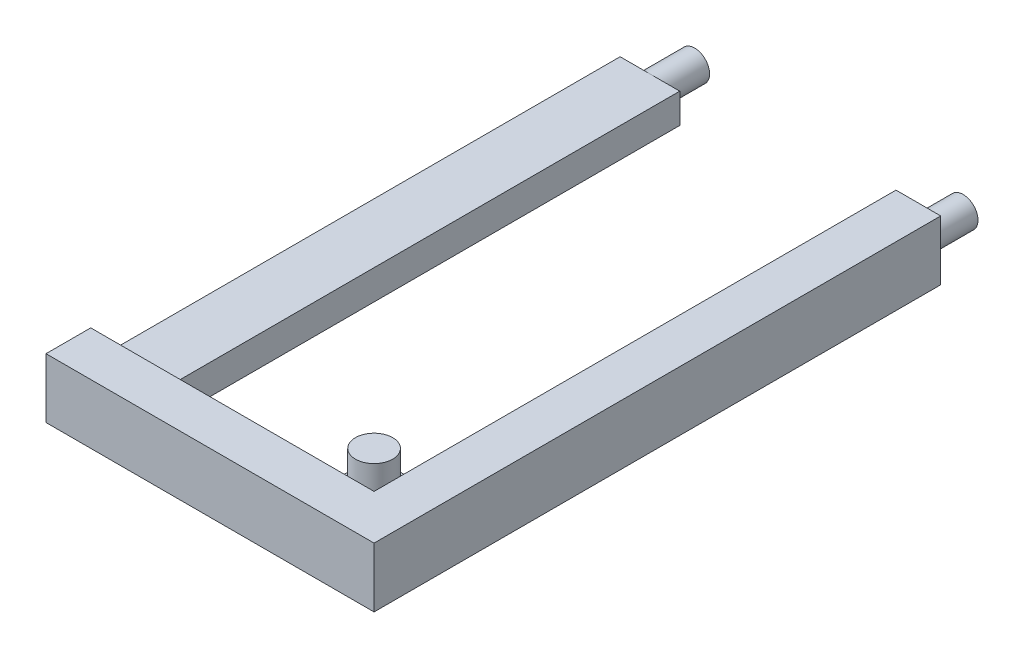
ISO-10303-21;
HEADER;
FILE_DESCRIPTION(('STEP AP214'),'2;1');
FILE_NAME('part.step','',(''),(''),'','','');
FILE_SCHEMA(('AUTOMOTIVE_DESIGN { 1 0 10303 214 1 1 1 1 }'));
ENDSEC;
DATA;
#1=APPLICATION_CONTEXT('core data for automotive mechanical design processes');
#2=APPLICATION_PROTOCOL_DEFINITION('international standard','automotive_design',2000,#1);
#3=PRODUCT_CONTEXT('',#1,'mechanical');
#4=PRODUCT('Part','Part','',(#3));
#5=PRODUCT_RELATED_PRODUCT_CATEGORY('part','',(#4));
#6=PRODUCT_DEFINITION_FORMATION('','',#4);
#7=PRODUCT_DEFINITION_CONTEXT('part definition',#1,'design');
#8=PRODUCT_DEFINITION('design','',#6,#7);
#9=PRODUCT_DEFINITION_SHAPE('','',#8);
#10=(LENGTH_UNIT() NAMED_UNIT(*) SI_UNIT(.MILLI.,.METRE.));
#11=(NAMED_UNIT(*) PLANE_ANGLE_UNIT() SI_UNIT($,.RADIAN.));
#12=(NAMED_UNIT(*) SI_UNIT($,.STERADIAN.) SOLID_ANGLE_UNIT());
#13=UNCERTAINTY_MEASURE_WITH_UNIT(LENGTH_MEASURE(1.E-05),#10,'distance_accuracy_value','');
#14=(GEOMETRIC_REPRESENTATION_CONTEXT(3) GLOBAL_UNCERTAINTY_ASSIGNED_CONTEXT((#13)) GLOBAL_UNIT_ASSIGNED_CONTEXT((#10,
#11,#12)) REPRESENTATION_CONTEXT('',''));
#15=CARTESIAN_POINT('',(0.,0.,0.));
#16=DIRECTION('',(0.,0.,1.));
#17=DIRECTION('',(1.,0.,0.));
#18=AXIS2_PLACEMENT_3D('',#15,#16,#17);
#19=CARTESIAN_POINT('',(-2.5,3.,17.5));
#20=DIRECTION('',(1.,0.,0.));
#21=DIRECTION('',(0.,0.,-1.));
#22=AXIS2_PLACEMENT_3D('',#19,#20,#21);
#23=PLANE('',#22);
#24=DIRECTION('',(0.,-1.,0.));
#25=VECTOR('',#24,1.);
#26=CARTESIAN_POINT('',(-2.5,0.,17.5));
#27=LINE('',#26,#25);
#28=CARTESIAN_POINT('',(-2.5,4.,17.5));
#29=VERTEX_POINT('',#28);
#30=CARTESIAN_POINT('',(-2.5,0.,17.5));
#31=VERTEX_POINT('',#30);
#32=EDGE_CURVE('E255',#29,#31,#27,.T.);
#33=ORIENTED_EDGE('',*,*,#32,.T.);
#34=DIRECTION('',(0.,0.,1.));
#35=VECTOR('',#34,1.);
#36=CARTESIAN_POINT('',(-2.5,0.,17.5));
#37=LINE('',#36,#35);
#38=CARTESIAN_POINT('',(-2.5,0.,20.5));
#39=VERTEX_POINT('',#38);
#40=EDGE_CURVE('E233',#31,#39,#37,.T.);
#41=ORIENTED_EDGE('',*,*,#40,.T.);
#42=DIRECTION('',(0.,-1.,0.));
#43=VECTOR('',#42,1.);
#44=CARTESIAN_POINT('',(-2.5,0.,20.5));
#45=LINE('',#44,#43);
#46=CARTESIAN_POINT('',(-2.5,4.,20.5));
#47=VERTEX_POINT('',#46);
#48=EDGE_CURVE('E250',#47,#39,#45,.T.);
#49=ORIENTED_EDGE('',*,*,#48,.F.);
#50=DIRECTION('',(0.,0.,-1.));
#51=VECTOR('',#50,1.);
#52=CARTESIAN_POINT('',(-2.5,4.,20.5));
#53=LINE('',#52,#51);
#54=EDGE_CURVE('E245',#47,#29,#53,.T.);
#55=ORIENTED_EDGE('',*,*,#54,.T.);
#56=EDGE_LOOP('',(#33,#41,#49,#55));
#57=FACE_BOUND('',#56,.T.);
#58=ADVANCED_FACE('F43',(#57),#23,.F.);
#59=CARTESIAN_POINT('',(0.,0.,0.));
#60=DIRECTION('',(0.,-1.,0.));
#61=DIRECTION('',(0.,0.,-1.));
#62=AXIS2_PLACEMENT_3D('',#59,#60,#61);
#63=PLANE('',#62);
#64=ORIENTED_EDGE('',*,*,#40,.F.);
#65=DIRECTION('',(1.,0.,0.));
#66=VECTOR('',#65,1.);
#67=CARTESIAN_POINT('',(-2.5,0.,17.5));
#68=LINE('',#67,#66);
#69=CARTESIAN_POINT('',(11.5,0.,17.5));
#70=VERTEX_POINT('',#69);
#71=EDGE_CURVE('E251',#31,#70,#68,.T.);
#72=ORIENTED_EDGE('',*,*,#71,.T.);
#73=DIRECTION('',(0.,0.,1.));
#74=VECTOR('',#73,1.);
#75=CARTESIAN_POINT('',(11.5,0.,17.5));
#76=LINE('',#75,#74);
#77=CARTESIAN_POINT('',(11.5,0.,12.5));
#78=VERTEX_POINT('',#77);
#79=EDGE_CURVE('E90',#78,#70,#76,.T.);
#80=ORIENTED_EDGE('',*,*,#79,.F.);
#81=DIRECTION('',(-1.,0.,0.));
#82=VECTOR('',#81,1.);
#83=CARTESIAN_POINT('',(16.5,0.,12.5));
#84=LINE('',#83,#82);
#85=CARTESIAN_POINT('',(16.5,0.,12.5));
#86=VERTEX_POINT('',#85);
#87=EDGE_CURVE('E278',#86,#78,#84,.T.);
#88=ORIENTED_EDGE('',*,*,#87,.F.);
#89=DIRECTION('',(0.,0.,-1.));
#90=VECTOR('',#89,1.);
#91=CARTESIAN_POINT('',(16.5,0.,20.5));
#92=LINE('',#91,#90);
#93=CARTESIAN_POINT('',(16.5,0.,-17.5));
#94=VERTEX_POINT('',#93);
#95=EDGE_CURVE('E325',#86,#94,#92,.T.);
#96=ORIENTED_EDGE('',*,*,#95,.T.);
#97=DIRECTION('',(-1.,0.,0.));
#98=VECTOR('',#97,1.);
#99=CARTESIAN_POINT('',(19.5,0.,-17.5));
#100=LINE('',#99,#98);
#101=CARTESIAN_POINT('',(19.5,0.,-17.5));
#102=VERTEX_POINT('',#101);
#103=EDGE_CURVE('E306',#102,#94,#100,.T.);
#104=ORIENTED_EDGE('',*,*,#103,.F.);
#105=DIRECTION('',(0.,0.,-1.));
#106=VECTOR('',#105,1.);
#107=CARTESIAN_POINT('',(19.5,0.,20.5));
#108=LINE('',#107,#106);
#109=CARTESIAN_POINT('',(19.5,0.,20.5));
#110=VERTEX_POINT('',#109);
#111=EDGE_CURVE('E335',#110,#102,#108,.T.);
#112=ORIENTED_EDGE('',*,*,#111,.F.);
#113=DIRECTION('',(1.,0.,0.));
#114=VECTOR('',#113,1.);
#115=CARTESIAN_POINT('',(-2.5,0.,20.5));
#116=LINE('',#115,#114);
#117=EDGE_CURVE('E261',#39,#110,#116,.T.);
#118=ORIENTED_EDGE('',*,*,#117,.F.);
#119=EDGE_LOOP('',(#64,#72,#80,#88,#96,#104,#112,#118));
#120=FACE_BOUND('',#119,.T.);
#121=ADVANCED_FACE('F417',(#120),#63,.T.);
#122=CARTESIAN_POINT('',(0.,0.,17.5));
#123=DIRECTION('',(0.,0.,-1.));
#124=DIRECTION('',(-1.,0.,0.));
#125=AXIS2_PLACEMENT_3D('',#122,#123,#124);
#126=PLANE('',#125);
#127=DIRECTION('',(0.,1.,0.));
#128=VECTOR('',#127,1.);
#129=CARTESIAN_POINT('',(11.5,0.,17.5));
#130=LINE('',#129,#128);
#131=CARTESIAN_POINT('',(11.5,1.,17.5));
#132=VERTEX_POINT('',#131);
#133=EDGE_CURVE('E258',#70,#132,#130,.T.);
#134=ORIENTED_EDGE('',*,*,#133,.F.);
#135=ORIENTED_EDGE('',*,*,#71,.F.);
#136=ORIENTED_EDGE('',*,*,#32,.F.);
#137=DIRECTION('',(-1.,0.,0.));
#138=VECTOR('',#137,1.);
#139=CARTESIAN_POINT('',(-2.5,4.,17.5));
#140=LINE('',#139,#138);
#141=CARTESIAN_POINT('',(16.5,4.,17.5));
#142=VERTEX_POINT('',#141);
#143=EDGE_CURVE('E82',#142,#29,#140,.T.);
#144=ORIENTED_EDGE('',*,*,#143,.F.);
#145=DIRECTION('',(0.,1.,0.));
#146=VECTOR('',#145,1.);
#147=CARTESIAN_POINT('',(16.5,1.,17.5));
#148=LINE('',#147,#146);
#149=CARTESIAN_POINT('',(16.5,1.,17.5));
#150=VERTEX_POINT('',#149);
#151=EDGE_CURVE('E282',#150,#142,#148,.T.);
#152=ORIENTED_EDGE('',*,*,#151,.F.);
#153=DIRECTION('',(1.,0.,0.));
#154=VECTOR('',#153,1.);
#155=CARTESIAN_POINT('',(11.5,1.,17.5));
#156=LINE('',#155,#154);
#157=EDGE_CURVE('E293',#132,#150,#156,.T.);
#158=ORIENTED_EDGE('',*,*,#157,.F.);
#159=EDGE_LOOP('',(#134,#135,#136,#144,#152,#158));
#160=FACE_BOUND('',#159,.T.);
#161=DIRECTION('',(-1.,0.,0.));
#162=VECTOR('',#161,1.);
#163=CARTESIAN_POINT('',(2.,2.49670160173995,17.5));
#164=LINE('',#163,#162);
#165=CARTESIAN_POINT('',(2.,2.49670160173995,17.5));
#166=VERTEX_POINT('',#165);
#167=CARTESIAN_POINT('',(-2.,2.49670160173995,17.5));
#168=VERTEX_POINT('',#167);
#169=EDGE_CURVE('E171',#166,#168,#164,.T.);
#170=ORIENTED_EDGE('',*,*,#169,.T.);
#171=DIRECTION('',(0.,-1.,0.));
#172=VECTOR('',#171,1.);
#173=CARTESIAN_POINT('',(-2.,0.50329839826005,17.5));
#174=LINE('',#173,#172);
#175=CARTESIAN_POINT('',(-2.,0.50329839826005,17.5));
#176=VERTEX_POINT('',#175);
#177=EDGE_CURVE('E448',#168,#176,#174,.T.);
#178=ORIENTED_EDGE('',*,*,#177,.T.);
#179=DIRECTION('',(1.,0.,0.));
#180=VECTOR('',#179,1.);
#181=CARTESIAN_POINT('',(2.,0.50329839826005,17.5));
#182=LINE('',#181,#180);
#183=CARTESIAN_POINT('',(2.,0.50329839826005,17.5));
#184=VERTEX_POINT('',#183);
#185=EDGE_CURVE('E452',#176,#184,#182,.T.);
#186=ORIENTED_EDGE('',*,*,#185,.T.);
#187=DIRECTION('',(0.,1.,0.));
#188=VECTOR('',#187,1.);
#189=CARTESIAN_POINT('',(2.,0.50329839826005,17.5));
#190=LINE('',#189,#188);
#191=EDGE_CURVE('E348',#184,#166,#190,.T.);
#192=ORIENTED_EDGE('',*,*,#191,.T.);
#193=EDGE_LOOP('',(#170,#178,#186,#192));
#194=FACE_BOUND('',#193,.T.);
#195=ADVANCED_FACE('F414',(#160,#194),#126,.T.);
#196=CARTESIAN_POINT('',(-2.5,4.,20.5));
#197=DIRECTION('',(0.,-1.,0.));
#198=DIRECTION('',(0.,0.,-1.));
#199=AXIS2_PLACEMENT_3D('',#196,#197,#198);
#200=PLANE('',#199);
#201=DIRECTION('',(-1.,0.,0.));
#202=VECTOR('',#201,1.);
#203=CARTESIAN_POINT('',(-2.5,4.,20.5));
#204=LINE('',#203,#202);
#205=CARTESIAN_POINT('',(19.5,4.,20.5));
#206=VERTEX_POINT('',#205);
#207=EDGE_CURVE('E71',#206,#47,#204,.T.);
#208=ORIENTED_EDGE('',*,*,#207,.F.);
#209=DIRECTION('',(0.,0.,1.));
#210=VECTOR('',#209,1.);
#211=CARTESIAN_POINT('',(19.5,4.,20.5));
#212=LINE('',#211,#210);
#213=CARTESIAN_POINT('',(19.5,4.,-17.5));
#214=VERTEX_POINT('',#213);
#215=EDGE_CURVE('E317',#214,#206,#212,.T.);
#216=ORIENTED_EDGE('',*,*,#215,.F.);
#217=DIRECTION('',(-1.,0.,0.));
#218=VECTOR('',#217,1.);
#219=CARTESIAN_POINT('',(19.5,4.,-17.5));
#220=LINE('',#219,#218);
#221=CARTESIAN_POINT('',(16.5,4.,-17.5));
#222=VERTEX_POINT('',#221);
#223=EDGE_CURVE('E313',#214,#222,#220,.T.);
#224=ORIENTED_EDGE('',*,*,#223,.T.);
#225=DIRECTION('',(0.,0.,1.));
#226=VECTOR('',#225,1.);
#227=CARTESIAN_POINT('',(16.5,4.,20.5));
#228=LINE('',#227,#226);
#229=EDGE_CURVE('E318',#222,#142,#228,.T.);
#230=ORIENTED_EDGE('',*,*,#229,.T.);
#231=ORIENTED_EDGE('',*,*,#143,.T.);
#232=ORIENTED_EDGE('',*,*,#54,.F.);
#233=EDGE_LOOP('',(#208,#216,#224,#230,#231,#232));
#234=FACE_BOUND('',#233,.T.);
#235=ADVANCED_FACE('F413',(#234),#200,.F.);
#236=CARTESIAN_POINT('',(0.,0.,20.5));
#237=DIRECTION('',(0.,0.,-1.));
#238=DIRECTION('',(-1.,0.,0.));
#239=AXIS2_PLACEMENT_3D('',#236,#237,#238);
#240=PLANE('',#239);
#241=ORIENTED_EDGE('',*,*,#48,.T.);
#242=ORIENTED_EDGE('',*,*,#117,.T.);
#243=DIRECTION('',(0.,-1.,0.));
#244=VECTOR('',#243,1.);
#245=CARTESIAN_POINT('',(19.5,0.,20.5));
#246=LINE('',#245,#244);
#247=EDGE_CURVE('E321',#206,#110,#246,.T.);
#248=ORIENTED_EDGE('',*,*,#247,.F.);
#249=ORIENTED_EDGE('',*,*,#207,.T.);
#250=EDGE_LOOP('',(#241,#242,#248,#249));
#251=FACE_BOUND('',#250,.T.);
#252=ADVANCED_FACE('F407',(#251),#240,.F.);
#253=CARTESIAN_POINT('',(11.5,0.,17.5));
#254=DIRECTION('',(-1.,0.,0.));
#255=DIRECTION('',(0.,0.,1.));
#256=AXIS2_PLACEMENT_3D('',#253,#254,#255);
#257=PLANE('',#256);
#258=DIRECTION('',(0.,0.,1.));
#259=VECTOR('',#258,1.);
#260=CARTESIAN_POINT('',(11.5,1.,17.5));
#261=LINE('',#260,#259);
#262=CARTESIAN_POINT('',(11.5,1.,12.5));
#263=VERTEX_POINT('',#262);
#264=EDGE_CURVE('E297',#263,#132,#261,.T.);
#265=ORIENTED_EDGE('',*,*,#264,.F.);
#266=DIRECTION('',(0.,1.,0.));
#267=VECTOR('',#266,1.);
#268=CARTESIAN_POINT('',(11.5,0.,12.5));
#269=LINE('',#268,#267);
#270=EDGE_CURVE('E270',#78,#263,#269,.T.);
#271=ORIENTED_EDGE('',*,*,#270,.F.);
#272=ORIENTED_EDGE('',*,*,#79,.T.);
#273=ORIENTED_EDGE('',*,*,#133,.T.);
#274=EDGE_LOOP('',(#265,#271,#272,#273));
#275=FACE_BOUND('',#274,.T.);
#276=ADVANCED_FACE('F404',(#275),#257,.T.);
#277=CARTESIAN_POINT('',(16.5,0.,12.5));
#278=DIRECTION('',(0.,0.,-1.));
#279=DIRECTION('',(-1.,0.,0.));
#280=AXIS2_PLACEMENT_3D('',#277,#278,#279);
#281=PLANE('',#280);
#282=DIRECTION('',(-1.,0.,0.));
#283=VECTOR('',#282,1.);
#284=CARTESIAN_POINT('',(11.5,1.,12.5));
#285=LINE('',#284,#283);
#286=CARTESIAN_POINT('',(16.5,1.,12.5));
#287=VERTEX_POINT('',#286);
#288=EDGE_CURVE('E286',#287,#263,#285,.T.);
#289=ORIENTED_EDGE('',*,*,#288,.F.);
#290=DIRECTION('',(0.,1.,0.));
#291=VECTOR('',#290,1.);
#292=CARTESIAN_POINT('',(16.5,0.,12.5));
#293=LINE('',#292,#291);
#294=EDGE_CURVE('E266',#86,#287,#293,.T.);
#295=ORIENTED_EDGE('',*,*,#294,.F.);
#296=ORIENTED_EDGE('',*,*,#87,.T.);
#297=ORIENTED_EDGE('',*,*,#270,.T.);
#298=EDGE_LOOP('',(#289,#295,#296,#297));
#299=FACE_BOUND('',#298,.T.);
#300=ADVANCED_FACE('F402',(#299),#281,.T.);
#301=CARTESIAN_POINT('',(0.,1.,0.));
#302=DIRECTION('',(0.,-1.,0.));
#303=DIRECTION('',(0.,0.,-1.));
#304=AXIS2_PLACEMENT_3D('',#301,#302,#303);
#305=PLANE('',#304);
#306=CARTESIAN_POINT('',(14.,1.,15.));
#307=DIRECTION('',(0.,1.,0.));
#308=DIRECTION('',(0.,0.,1.));
#309=AXIS2_PLACEMENT_3D('',#306,#307,#308);
#310=CIRCLE('',#309,1.25);
#311=CARTESIAN_POINT('',(14.,1.,16.25));
#312=VERTEX_POINT('',#311);
#313=EDGE_CURVE('E301',#312,#312,#310,.T.);
#314=ORIENTED_EDGE('',*,*,#313,.F.);
#315=EDGE_LOOP('',(#314));
#316=FACE_BOUND('',#315,.T.);
#317=ORIENTED_EDGE('',*,*,#264,.T.);
#318=ORIENTED_EDGE('',*,*,#157,.T.);
#319=DIRECTION('',(0.,0.,-1.));
#320=VECTOR('',#319,1.);
#321=CARTESIAN_POINT('',(16.5,1.,17.5));
#322=LINE('',#321,#320);
#323=EDGE_CURVE('E289',#150,#287,#322,.T.);
#324=ORIENTED_EDGE('',*,*,#323,.T.);
#325=ORIENTED_EDGE('',*,*,#288,.T.);
#326=EDGE_LOOP('',(#317,#318,#324,#325));
#327=FACE_BOUND('',#326,.T.);
#328=ADVANCED_FACE('F398',(#316,#327),#305,.F.);
#329=CARTESIAN_POINT('',(14.,1.,15.));
#330=DIRECTION('',(0.,1.,0.));
#331=DIRECTION('',(0.,0.,1.));
#332=AXIS2_PLACEMENT_3D('',#329,#330,#331);
#333=CYLINDRICAL_SURFACE('',#332,1.25);
#334=ORIENTED_EDGE('',*,*,#313,.T.);
#335=EDGE_LOOP('',(#334));
#336=FACE_BOUND('',#335,.T.);
#337=CARTESIAN_POINT('',(14.,4.,15.));
#338=DIRECTION('',(0.,1.,0.));
#339=DIRECTION('',(0.,0.,1.));
#340=AXIS2_PLACEMENT_3D('',#337,#338,#339);
#341=CIRCLE('',#340,1.25);
#342=CARTESIAN_POINT('',(14.,4.,16.25));
#343=VERTEX_POINT('',#342);
#344=EDGE_CURVE('E302',#343,#343,#341,.T.);
#345=ORIENTED_EDGE('',*,*,#344,.F.);
#346=EDGE_LOOP('',(#345));
#347=FACE_BOUND('',#346,.T.);
#348=ADVANCED_FACE('F395',(#336,#347),#333,.T.);
#349=ORIENTED_EDGE('',*,*,#344,.T.);
#350=EDGE_LOOP('',(#349));
#351=FACE_BOUND('',#350,.T.);
#352=ADVANCED_FACE('F393',(#351),#200,.F.);
#353=CARTESIAN_POINT('',(19.5,0.,-17.5));
#354=DIRECTION('',(0.,0.,1.));
#355=DIRECTION('',(1.,0.,0.));
#356=AXIS2_PLACEMENT_3D('',#353,#354,#355);
#357=PLANE('',#356);
#358=CARTESIAN_POINT('',(18.,2.,-17.5));
#359=DIRECTION('',(0.,0.,1.));
#360=DIRECTION('',(1.,0.,0.));
#361=AXIS2_PLACEMENT_3D('',#358,#359,#360);
#362=CIRCLE('',#361,1.);
#363=CARTESIAN_POINT('',(19.,2.,-17.5));
#364=VERTEX_POINT('',#363);
#365=EDGE_CURVE('E228',#364,#364,#362,.F.);
#366=ORIENTED_EDGE('',*,*,#365,.F.);
#367=EDGE_LOOP('',(#366));
#368=FACE_BOUND('',#367,.T.);
#369=DIRECTION('',(0.,1.,0.));
#370=VECTOR('',#369,1.);
#371=CARTESIAN_POINT('',(16.5,0.,-17.5));
#372=LINE('',#371,#370);
#373=EDGE_CURVE('E322',#94,#222,#372,.T.);
#374=ORIENTED_EDGE('',*,*,#373,.T.);
#375=ORIENTED_EDGE('',*,*,#223,.F.);
#376=DIRECTION('',(0.,1.,0.));
#377=VECTOR('',#376,1.);
#378=CARTESIAN_POINT('',(19.5,0.,-17.5));
#379=LINE('',#378,#377);
#380=EDGE_CURVE('E332',#102,#214,#379,.T.);
#381=ORIENTED_EDGE('',*,*,#380,.F.);
#382=ORIENTED_EDGE('',*,*,#103,.T.);
#383=EDGE_LOOP('',(#374,#375,#381,#382));
#384=FACE_BOUND('',#383,.T.);
#385=ADVANCED_FACE('F386',(#368,#384),#357,.F.);
#386=CARTESIAN_POINT('',(19.5,0.,0.));
#387=DIRECTION('',(-1.,0.,0.));
#388=DIRECTION('',(0.,0.,1.));
#389=AXIS2_PLACEMENT_3D('',#386,#387,#388);
#390=PLANE('',#389);
#391=ORIENTED_EDGE('',*,*,#247,.T.);
#392=ORIENTED_EDGE('',*,*,#111,.T.);
#393=ORIENTED_EDGE('',*,*,#380,.T.);
#394=ORIENTED_EDGE('',*,*,#215,.T.);
#395=EDGE_LOOP('',(#391,#392,#393,#394));
#396=FACE_BOUND('',#395,.T.);
#397=ADVANCED_FACE('F383',(#396),#390,.F.);
#398=CARTESIAN_POINT('',(16.5,0.,0.));
#399=DIRECTION('',(-1.,0.,0.));
#400=DIRECTION('',(0.,0.,1.));
#401=AXIS2_PLACEMENT_3D('',#398,#399,#400);
#402=PLANE('',#401);
#403=ORIENTED_EDGE('',*,*,#323,.F.);
#404=ORIENTED_EDGE('',*,*,#151,.T.);
#405=ORIENTED_EDGE('',*,*,#229,.F.);
#406=ORIENTED_EDGE('',*,*,#373,.F.);
#407=ORIENTED_EDGE('',*,*,#95,.F.);
#408=ORIENTED_EDGE('',*,*,#294,.T.);
#409=EDGE_LOOP('',(#403,#404,#405,#406,#407,#408));
#410=FACE_BOUND('',#409,.T.);
#411=ADVANCED_FACE('F381',(#410),#402,.T.);
#412=CARTESIAN_POINT('',(18.,2.,-20.5));
#413=DIRECTION('',(0.,0.,1.));
#414=DIRECTION('',(1.,0.,0.));
#415=AXIS2_PLACEMENT_3D('',#412,#413,#414);
#416=CYLINDRICAL_SURFACE('',#415,1.);
#417=CARTESIAN_POINT('',(18.,2.,-20.5));
#418=DIRECTION('',(0.,0.,-1.));
#419=DIRECTION('',(-1.,0.,0.));
#420=AXIS2_PLACEMENT_3D('',#417,#418,#419);
#421=CIRCLE('',#420,1.);
#422=CARTESIAN_POINT('',(17.,2.,-20.5));
#423=VERTEX_POINT('',#422);
#424=EDGE_CURVE('E328',#423,#423,#421,.T.);
#425=ORIENTED_EDGE('',*,*,#424,.F.);
#426=EDGE_LOOP('',(#425));
#427=FACE_BOUND('',#426,.T.);
#428=ORIENTED_EDGE('',*,*,#365,.T.);
#429=EDGE_LOOP('',(#428));
#430=FACE_BOUND('',#429,.T.);
#431=ADVANCED_FACE('F377',(#427,#430),#416,.T.);
#432=CARTESIAN_POINT('',(18.,2.,-20.5));
#433=DIRECTION('',(0.,0.,-1.));
#434=DIRECTION('',(-1.,0.,0.));
#435=AXIS2_PLACEMENT_3D('',#432,#433,#434);
#436=PLANE('',#435);
#437=ORIENTED_EDGE('',*,*,#424,.T.);
#438=EDGE_LOOP('',(#437));
#439=FACE_BOUND('',#438,.T.);
#440=ADVANCED_FACE('F361',(#439),#436,.T.);
#441=CARTESIAN_POINT('',(2.,2.49670160173995,23.3309518948453));
#442=DIRECTION('',(0.,1.,0.));
#443=DIRECTION('',(0.,0.,1.));
#444=AXIS2_PLACEMENT_3D('',#441,#442,#443);
#445=PLANE('',#444);
#446=DIRECTION('',(0.,0.,-1.));
#447=VECTOR('',#446,1.);
#448=CARTESIAN_POINT('',(2.,2.49670160173995,23.3309518948453));
#449=LINE('',#448,#447);
#450=CARTESIAN_POINT('',(2.,2.49670160173995,-17.5));
#451=VERTEX_POINT('',#450);
#452=EDGE_CURVE('E163',#166,#451,#449,.T.);
#453=ORIENTED_EDGE('',*,*,#452,.T.);
#454=DIRECTION('',(1.,0.,0.));
#455=VECTOR('',#454,1.);
#456=CARTESIAN_POINT('',(2.,2.49670160173995,-17.5));
#457=LINE('',#456,#455);
#458=CARTESIAN_POINT('',(0.0811536634355935,2.49670160173995,-17.5));
#459=VERTEX_POINT('',#458);
#460=EDGE_CURVE('E167',#459,#451,#457,.T.);
#461=ORIENTED_EDGE('',*,*,#460,.F.);
#462=CARTESIAN_POINT('',(0.,1.5,-17.5));
#463=DIRECTION('',(0.,0.,-1.));
#464=DIRECTION('',(-0.0811536634355934,0.99670160173995,0.));
#465=AXIS2_PLACEMENT_3D('',#462,#463,#464);
#466=CIRCLE('',#465,1.);
#467=CARTESIAN_POINT('',(-0.0811536634355933,2.49670160173995,-17.5));
#468=VERTEX_POINT('',#467);
#469=EDGE_CURVE('E226',#468,#459,#466,.T.);
#470=ORIENTED_EDGE('',*,*,#469,.F.);
#471=CARTESIAN_POINT('',(-2.,2.49670160173995,-17.5));
#472=VERTEX_POINT('',#471);
#473=EDGE_CURVE('E186',#472,#468,#457,.T.);
#474=ORIENTED_EDGE('',*,*,#473,.F.);
#475=DIRECTION('',(0.,0.,-1.));
#476=VECTOR('',#475,1.);
#477=CARTESIAN_POINT('',(-2.,2.49670160173995,23.3309518948453));
#478=LINE('',#477,#476);
#479=EDGE_CURVE('E176',#168,#472,#478,.T.);
#480=ORIENTED_EDGE('',*,*,#479,.F.);
#481=ORIENTED_EDGE('',*,*,#169,.F.);
#482=EDGE_LOOP('',(#453,#461,#470,#474,#480,#481));
#483=FACE_BOUND('',#482,.T.);
#484=ADVANCED_FACE('F165',(#483),#445,.T.);
#485=CARTESIAN_POINT('',(2.,0.50329839826005,23.3309518948453));
#486=DIRECTION('',(1.,0.,0.));
#487=DIRECTION('',(0.,0.,-1.));
#488=AXIS2_PLACEMENT_3D('',#485,#486,#487);
#489=PLANE('',#488);
#490=DIRECTION('',(0.,0.,-1.));
#491=VECTOR('',#490,1.);
#492=CARTESIAN_POINT('',(2.,0.50329839826005,23.3309518948453));
#493=LINE('',#492,#491);
#494=CARTESIAN_POINT('',(2.,0.50329839826005,-17.5));
#495=VERTEX_POINT('',#494);
#496=EDGE_CURVE('E175',#184,#495,#493,.T.);
#497=ORIENTED_EDGE('',*,*,#496,.T.);
#498=DIRECTION('',(0.,-1.,0.));
#499=VECTOR('',#498,1.);
#500=CARTESIAN_POINT('',(2.,0.50329839826005,-17.5));
#501=LINE('',#500,#499);
#502=EDGE_CURVE('E179',#451,#495,#501,.T.);
#503=ORIENTED_EDGE('',*,*,#502,.F.);
#504=ORIENTED_EDGE('',*,*,#452,.F.);
#505=ORIENTED_EDGE('',*,*,#191,.F.);
#506=EDGE_LOOP('',(#497,#503,#504,#505));
#507=FACE_BOUND('',#506,.T.);
#508=ADVANCED_FACE('F180',(#507),#489,.T.);
#509=CARTESIAN_POINT('',(2.,0.50329839826005,23.3309518948453));
#510=DIRECTION('',(0.,-1.,0.));
#511=DIRECTION('',(0.,0.,-1.));
#512=AXIS2_PLACEMENT_3D('',#509,#510,#511);
#513=PLANE('',#512);
#514=DIRECTION('',(0.,0.,-1.));
#515=VECTOR('',#514,1.);
#516=CARTESIAN_POINT('',(-2.,0.50329839826005,23.3309518948453));
#517=LINE('',#516,#515);
#518=CARTESIAN_POINT('',(-2.,0.50329839826005,-17.5));
#519=VERTEX_POINT('',#518);
#520=EDGE_CURVE('E213',#176,#519,#517,.T.);
#521=ORIENTED_EDGE('',*,*,#520,.T.);
#522=DIRECTION('',(-1.,0.,0.));
#523=VECTOR('',#522,1.);
#524=CARTESIAN_POINT('',(2.,0.50329839826005,-17.5));
#525=LINE('',#524,#523);
#526=CARTESIAN_POINT('',(-0.0811536634355933,0.50329839826005,-17.5));
#527=VERTEX_POINT('',#526);
#528=EDGE_CURVE('E62',#527,#519,#525,.T.);
#529=ORIENTED_EDGE('',*,*,#528,.F.);
#530=CARTESIAN_POINT('',(0.,1.5,-17.5));
#531=DIRECTION('',(0.,0.,-1.));
#532=DIRECTION('',(0.0811536634355931,-0.99670160173995,0.));
#533=AXIS2_PLACEMENT_3D('',#530,#531,#532);
#534=CIRCLE('',#533,1.);
#535=CARTESIAN_POINT('',(0.0811536634355935,0.50329839826005,-17.5));
#536=VERTEX_POINT('',#535);
#537=EDGE_CURVE('E11',#536,#527,#534,.T.);
#538=ORIENTED_EDGE('',*,*,#537,.F.);
#539=EDGE_CURVE('E219',#495,#536,#525,.T.);
#540=ORIENTED_EDGE('',*,*,#539,.F.);
#541=ORIENTED_EDGE('',*,*,#496,.F.);
#542=ORIENTED_EDGE('',*,*,#185,.F.);
#543=EDGE_LOOP('',(#521,#529,#538,#540,#541,#542));
#544=FACE_BOUND('',#543,.T.);
#545=ADVANCED_FACE('F221',(#544),#513,.T.);
#546=CARTESIAN_POINT('',(-2.,0.50329839826005,23.3309518948453));
#547=DIRECTION('',(-1.,0.,0.));
#548=DIRECTION('',(0.,0.,1.));
#549=AXIS2_PLACEMENT_3D('',#546,#547,#548);
#550=PLANE('',#549);
#551=ORIENTED_EDGE('',*,*,#479,.T.);
#552=DIRECTION('',(0.,1.,0.));
#553=VECTOR('',#552,1.);
#554=CARTESIAN_POINT('',(-2.,0.50329839826005,-17.5));
#555=LINE('',#554,#553);
#556=EDGE_CURVE('E192',#519,#472,#555,.T.);
#557=ORIENTED_EDGE('',*,*,#556,.F.);
#558=ORIENTED_EDGE('',*,*,#520,.F.);
#559=ORIENTED_EDGE('',*,*,#177,.F.);
#560=EDGE_LOOP('',(#551,#557,#558,#559));
#561=FACE_BOUND('',#560,.T.);
#562=ADVANCED_FACE('F362',(#561),#550,.T.);
#563=CARTESIAN_POINT('',(0.,1.5,-20.5));
#564=DIRECTION('',(0.,0.,-1.));
#565=DIRECTION('',(-1.,0.,0.));
#566=AXIS2_PLACEMENT_3D('',#563,#564,#565);
#567=PLANE('',#566);
#568=CARTESIAN_POINT('',(0.,1.5,-20.5));
#569=DIRECTION('',(0.,0.,-1.));
#570=DIRECTION('',(-1.,0.,0.));
#571=AXIS2_PLACEMENT_3D('',#568,#569,#570);
#572=CIRCLE('',#571,1.);
#573=CARTESIAN_POINT('',(-1.,1.5,-20.5));
#574=VERTEX_POINT('',#573);
#575=EDGE_CURVE('E344',#574,#574,#572,.T.);
#576=ORIENTED_EDGE('',*,*,#575,.T.);
#577=EDGE_LOOP('',(#576));
#578=FACE_BOUND('',#577,.T.);
#579=ADVANCED_FACE('F364',(#578),#567,.T.);
#580=CARTESIAN_POINT('',(0.,1.5,-20.5));
#581=DIRECTION('',(0.,0.,1.));
#582=DIRECTION('',(1.,0.,0.));
#583=AXIS2_PLACEMENT_3D('',#580,#581,#582);
#584=CYLINDRICAL_SURFACE('',#583,1.);
#585=ORIENTED_EDGE('',*,*,#575,.F.);
#586=EDGE_LOOP('',(#585));
#587=FACE_BOUND('',#586,.T.);
#588=ORIENTED_EDGE('',*,*,#537,.T.);
#589=CARTESIAN_POINT('',(0.,1.5,-17.5));
#590=DIRECTION('',(0.,0.,1.));
#591=DIRECTION('',(1.,0.,0.));
#592=AXIS2_PLACEMENT_3D('',#589,#590,#591);
#593=CIRCLE('',#592,1.);
#594=EDGE_CURVE('E55',#527,#468,#593,.F.);
#595=ORIENTED_EDGE('',*,*,#594,.T.);
#596=ORIENTED_EDGE('',*,*,#469,.T.);
#597=EDGE_CURVE('E189',#459,#536,#593,.F.);
#598=ORIENTED_EDGE('',*,*,#597,.T.);
#599=EDGE_LOOP('',(#588,#595,#596,#598));
#600=FACE_BOUND('',#599,.T.);
#601=ADVANCED_FACE('F225',(#587,#600),#584,.T.);
#602=CARTESIAN_POINT('',(-2.5,3.,-17.5));
#603=DIRECTION('',(0.,0.,1.));
#604=DIRECTION('',(1.,0.,0.));
#605=AXIS2_PLACEMENT_3D('',#602,#603,#604);
#606=PLANE('',#605);
#607=ORIENTED_EDGE('',*,*,#473,.T.);
#608=ORIENTED_EDGE('',*,*,#594,.F.);
#609=ORIENTED_EDGE('',*,*,#528,.T.);
#610=ORIENTED_EDGE('',*,*,#556,.T.);
#611=EDGE_LOOP('',(#607,#608,#609,#610));
#612=FACE_BOUND('',#611,.T.);
#613=ADVANCED_FACE('F369',(#612),#606,.F.);
#614=ORIENTED_EDGE('',*,*,#460,.T.);
#615=ORIENTED_EDGE('',*,*,#502,.T.);
#616=ORIENTED_EDGE('',*,*,#539,.T.);
#617=ORIENTED_EDGE('',*,*,#597,.F.);
#618=EDGE_LOOP('',(#614,#615,#616,#617));
#619=FACE_BOUND('',#618,.T.);
#620=ADVANCED_FACE('F45',(#619),#606,.F.);
#621=CLOSED_SHELL('',(#58,#121,#195,#235,#252,#276,#300,#328,#348,#352,#385,#397,#411,#431,#440,
#484,#508,#545,#562,#579,#601,#613,#620));
#622=MANIFOLD_SOLID_BREP('B2',#621);
#623=ADVANCED_BREP_SHAPE_REPRESENTATION('',(#18,#622),#14);
#624=SHAPE_DEFINITION_REPRESENTATION(#9,#623);
ENDSEC;
END-ISO-10303-21;
